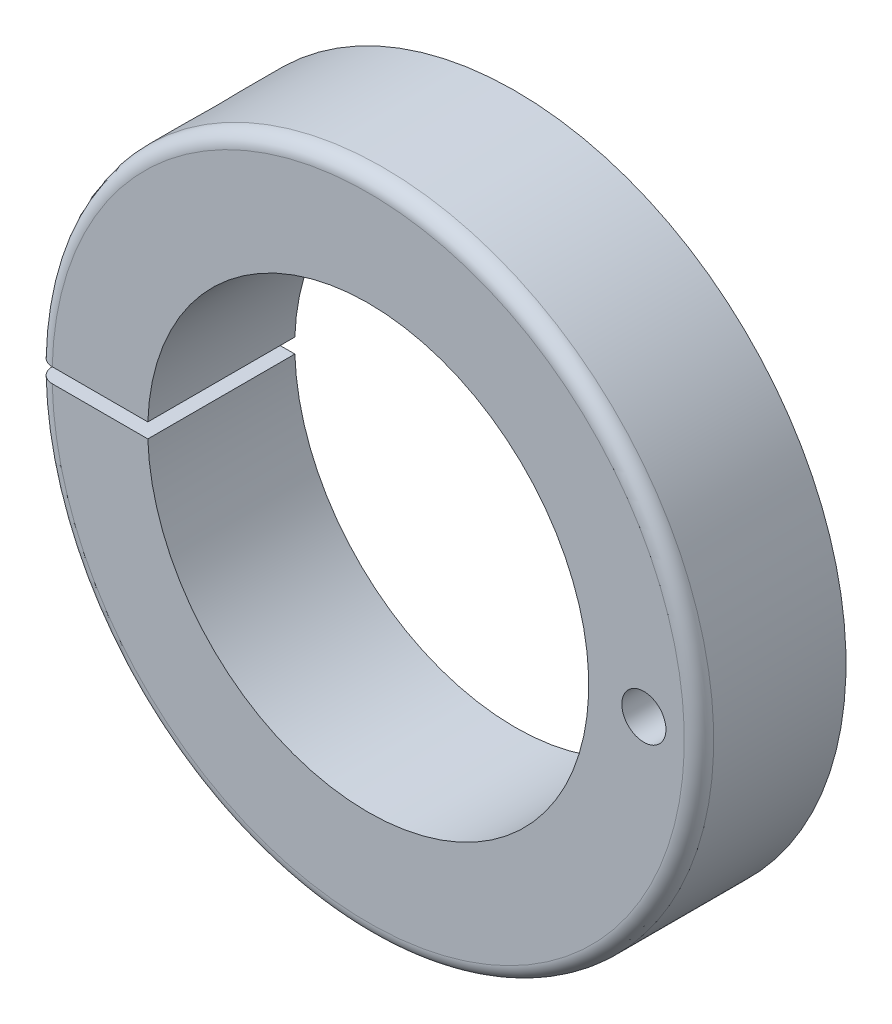
ISO-10303-21;
HEADER;
FILE_DESCRIPTION(('STEP AP214'),'2;1');
FILE_NAME('part.step','',(''),(''),'','','');
FILE_SCHEMA(('AUTOMOTIVE_DESIGN { 1 0 10303 214 1 1 1 1 }'));
ENDSEC;
DATA;
#1=APPLICATION_CONTEXT('core data for automotive mechanical design processes');
#2=APPLICATION_PROTOCOL_DEFINITION('international standard','automotive_design',2000,#1);
#3=PRODUCT_CONTEXT('',#1,'mechanical');
#4=PRODUCT('Part','Part','',(#3));
#5=PRODUCT_RELATED_PRODUCT_CATEGORY('part','',(#4));
#6=PRODUCT_DEFINITION_FORMATION('','',#4);
#7=PRODUCT_DEFINITION_CONTEXT('part definition',#1,'design');
#8=PRODUCT_DEFINITION('design','',#6,#7);
#9=PRODUCT_DEFINITION_SHAPE('','',#8);
#10=(LENGTH_UNIT() NAMED_UNIT(*) SI_UNIT(.MILLI.,.METRE.));
#11=(NAMED_UNIT(*) PLANE_ANGLE_UNIT() SI_UNIT($,.RADIAN.));
#12=(NAMED_UNIT(*) SI_UNIT($,.STERADIAN.) SOLID_ANGLE_UNIT());
#13=UNCERTAINTY_MEASURE_WITH_UNIT(LENGTH_MEASURE(1.E-05),#10,'distance_accuracy_value','');
#14=(GEOMETRIC_REPRESENTATION_CONTEXT(3) GLOBAL_UNCERTAINTY_ASSIGNED_CONTEXT((#13)) GLOBAL_UNIT_ASSIGNED_CONTEXT((#10,
#11,#12)) REPRESENTATION_CONTEXT('',''));
#15=CARTESIAN_POINT('',(0.,0.,0.));
#16=DIRECTION('',(0.,0.,1.));
#17=DIRECTION('',(1.,0.,0.));
#18=AXIS2_PLACEMENT_3D('',#15,#16,#17);
#19=CARTESIAN_POINT('',(-37.5,-45.,10.));
#20=DIRECTION('',(0.,1.,0.));
#21=DIRECTION('',(0.,0.,1.));
#22=AXIS2_PLACEMENT_3D('',#19,#20,#21);
#23=CYLINDRICAL_SURFACE('',#22,3.);
#24=CARTESIAN_POINT('',(-37.5,1.,10.));
#25=DIRECTION('',(0.,1.,0.));
#26=DIRECTION('',(0.,0.,1.));
#27=AXIS2_PLACEMENT_3D('',#24,#25,#26);
#28=CIRCLE('',#27,3.);
#29=CARTESIAN_POINT('',(-37.5,0.999999999999994,13.));
#30=VERTEX_POINT('',#29);
#31=EDGE_CURVE('E118',#30,#30,#28,.T.);
#32=CARTESIAN_POINT('',(-37.5,5.,10.));
#33=DIRECTION('',(0.,1.,0.));
#34=DIRECTION('',(0.,0.,1.));
#35=AXIS2_PLACEMENT_3D('',#32,#33,#34);
#36=CIRCLE('',#35,3.);
#37=CARTESIAN_POINT('',(-37.5,5.,13.));
#38=VERTEX_POINT('',#37);
#39=EDGE_CURVE('E123',#38,#38,#36,.F.);
#40=CARTESIAN_POINT('',(-37.5,0.999999999999994,13.));
#41=CARTESIAN_POINT('',(-37.5,1.04166666666666,13.));
#42=CARTESIAN_POINT('',(-37.5,1.08333333333333,13.));
#43=CARTESIAN_POINT('',(-37.5,1.16666666666666,13.));
#44=CARTESIAN_POINT('',(-37.5,1.20833333333333,13.));
#45=CARTESIAN_POINT('',(-37.5,1.29166666666666,13.));
#46=CARTESIAN_POINT('',(-37.5,1.33333333333333,13.));
#47=CARTESIAN_POINT('',(-37.5,1.41666666666666,13.));
#48=CARTESIAN_POINT('',(-37.5,1.45833333333333,13.));
#49=CARTESIAN_POINT('',(-37.5,1.54166666666666,13.));
#50=CARTESIAN_POINT('',(-37.5,1.58333333333333,13.));
#51=CARTESIAN_POINT('',(-37.5,1.66666666666666,13.));
#52=CARTESIAN_POINT('',(-37.5,1.70833333333333,13.));
#53=CARTESIAN_POINT('',(-37.5,1.79166666666666,13.));
#54=CARTESIAN_POINT('',(-37.5,1.83333333333333,13.));
#55=CARTESIAN_POINT('',(-37.5,1.91666666666666,13.));
#56=CARTESIAN_POINT('',(-37.5,1.95833333333333,13.));
#57=CARTESIAN_POINT('',(-37.5,2.04166666666666,13.));
#58=CARTESIAN_POINT('',(-37.5,2.08333333333333,13.));
#59=CARTESIAN_POINT('',(-37.5,2.16666666666666,13.));
#60=CARTESIAN_POINT('',(-37.5,2.20833333333333,13.));
#61=CARTESIAN_POINT('',(-37.5,2.29166666666666,13.));
#62=CARTESIAN_POINT('',(-37.5,2.33333333333333,13.));
#63=CARTESIAN_POINT('',(-37.5,2.41666666666666,13.));
#64=CARTESIAN_POINT('',(-37.5,2.45833333333333,13.));
#65=CARTESIAN_POINT('',(-37.5,2.54166666666666,13.));
#66=CARTESIAN_POINT('',(-37.5,2.58333333333333,13.));
#67=CARTESIAN_POINT('',(-37.5,2.66666666666666,13.));
#68=CARTESIAN_POINT('',(-37.5,2.70833333333333,13.));
#69=CARTESIAN_POINT('',(-37.5,2.79166666666666,13.));
#70=CARTESIAN_POINT('',(-37.5,2.83333333333333,13.));
#71=CARTESIAN_POINT('',(-37.5,2.91666666666666,13.));
#72=CARTESIAN_POINT('',(-37.5,2.95833333333333,13.));
#73=CARTESIAN_POINT('',(-37.5,3.04166666666666,13.));
#74=CARTESIAN_POINT('',(-37.5,3.08333333333333,13.));
#75=CARTESIAN_POINT('',(-37.5,3.16666666666666,13.));
#76=CARTESIAN_POINT('',(-37.5,3.20833333333333,13.));
#77=CARTESIAN_POINT('',(-37.5,3.29166666666666,13.));
#78=CARTESIAN_POINT('',(-37.5,3.33333333333333,13.));
#79=CARTESIAN_POINT('',(-37.5,3.41666666666666,13.));
#80=CARTESIAN_POINT('',(-37.5,3.45833333333333,13.));
#81=CARTESIAN_POINT('',(-37.5,3.54166666666666,13.));
#82=CARTESIAN_POINT('',(-37.5,3.58333333333333,13.));
#83=CARTESIAN_POINT('',(-37.5,3.66666666666666,13.));
#84=CARTESIAN_POINT('',(-37.5,3.70833333333333,13.));
#85=CARTESIAN_POINT('',(-37.5,3.79166666666666,13.));
#86=CARTESIAN_POINT('',(-37.5,3.83333333333333,13.));
#87=CARTESIAN_POINT('',(-37.5,3.91666666666666,13.));
#88=CARTESIAN_POINT('',(-37.5,3.95833333333333,13.));
#89=CARTESIAN_POINT('',(-37.5,4.04166666666666,13.));
#90=CARTESIAN_POINT('',(-37.5,4.08333333333333,13.));
#91=CARTESIAN_POINT('',(-37.5,4.16666666666666,13.));
#92=CARTESIAN_POINT('',(-37.5,4.20833333333333,13.));
#93=CARTESIAN_POINT('',(-37.5,4.29166666666666,13.));
#94=CARTESIAN_POINT('',(-37.5,4.33333333333333,13.));
#95=CARTESIAN_POINT('',(-37.5,4.41666666666666,13.));
#96=CARTESIAN_POINT('',(-37.5,4.45833333333333,13.));
#97=CARTESIAN_POINT('',(-37.5,4.54166666666666,13.));
#98=CARTESIAN_POINT('',(-37.5,4.58333333333333,13.));
#99=CARTESIAN_POINT('',(-37.5,4.66666666666666,13.));
#100=CARTESIAN_POINT('',(-37.5,4.70833333333333,13.));
#101=CARTESIAN_POINT('',(-37.5,4.79166666666666,13.));
#102=CARTESIAN_POINT('',(-37.5,4.83333333333333,13.));
#103=CARTESIAN_POINT('',(-37.5,4.91666666666666,13.));
#104=CARTESIAN_POINT('',(-37.5,4.95833333333333,13.));
#105=CARTESIAN_POINT('',(-37.5,5.,13.));
#106=B_SPLINE_CURVE_WITH_KNOTS('',3,(#40,#41,#42,#43,#44,#45,#46,#47,#48,#49,#50,#51,#52,#53,
#54,#55,#56,#57,#58,#59,#60,#61,#62,#63,#64,#65,#66,#67,#68,#69,#70,#71,#72,#73,#74,#75,#76,#77,
#78,#79,#80,#81,#82,#83,#84,#85,#86,#87,#88,#89,#90,#91,#92,#93,#94,#95,#96,#97,#98,#99,#100,
#101,#102,#103,#104,#105),.UNSPECIFIED.,.F.,.F.,(4,2,2,2,2,2,2,2,2,2,2,2,2,2,2,2,2,2,2,2,2,2,2,
2,2,2,2,2,2,2,2,2,4),(0.,0.125,0.25,0.375,0.5,0.625000000000001,0.750000000000001,
0.875000000000001,1.,1.125,1.25,1.375,1.5,1.625,1.75,1.875,2.,2.125,2.25,2.375,2.5,2.625,2.75,
2.875,3.,3.125,3.25,3.375,3.5,3.625,3.75,3.875,4.),.UNSPECIFIED.);
#107=EDGE_CURVE('BSEAM32',#30,#38,#106,.T.);
#108=ORIENTED_EDGE('',*,*,#31,.F.);
#109=ORIENTED_EDGE('',*,*,#39,.F.);
#110=ORIENTED_EDGE('',*,*,#107,.T.);
#111=ORIENTED_EDGE('',*,*,#107,.F.);
#112=EDGE_LOOP('',(#108,#110,#109,#111));
#113=FACE_BOUND('',#112,.T.);
#114=ADVANCED_FACE('F32',(#113),#23,.F.);
#115=CARTESIAN_POINT('',(0.,0.,20.));
#116=DIRECTION('',(0.,0.,-1.));
#117=DIRECTION('',(-1.,0.,0.));
#118=AXIS2_PLACEMENT_3D('',#115,#116,#117);
#119=CYLINDRICAL_SURFACE('',#118,45.);
#120=CARTESIAN_POINT('',(-37.5,24.8746859276655,17.));
#121=CARTESIAN_POINT('',(-37.8264549330707,24.382530066584,17.0000078774404));
#122=CARTESIAN_POINT('',(-38.1432428192413,23.8838821086372,16.977229290437));
#123=CARTESIAN_POINT('',(-38.7556311626632,22.8768191342086,16.893397142346));
#124=CARTESIAN_POINT('',(-39.0512212095184,22.3683994720993,16.8323249165217));
#125=CARTESIAN_POINT('',(-39.6210724464054,21.3428143480522,16.6774589416751));
#126=CARTESIAN_POINT('',(-39.8952710784044,20.8256282507804,16.5835733191458));
#127=CARTESIAN_POINT('',(-40.421051154808,19.7858034271867,16.3677477686881));
#128=CARTESIAN_POINT('',(-40.6726360538843,19.2631655473884,16.2458121360897));
#129=CARTESIAN_POINT('',(-41.0670923016283,18.4019310766534,16.0255293887333));
#130=CARTESIAN_POINT('',(-41.216615350141,18.0644939516555,15.9343864077902));
#131=CARTESIAN_POINT('',(-41.5064079726493,17.3883114710187,15.7427241404713));
#132=CARTESIAN_POINT('',(-41.6466777036975,17.0495661376868,15.6422050133028));
#133=CARTESIAN_POINT('',(-41.9180759155485,16.3709657639855,15.4323150868442));
#134=CARTESIAN_POINT('',(-42.0492000635373,16.0311102764186,15.322940144335));
#135=CARTESIAN_POINT('',(-42.3022943783851,15.3508174115848,15.0957714700742));
#136=CARTESIAN_POINT('',(-42.4242647697567,15.0103800487992,14.9779779449422));
#137=CARTESIAN_POINT('',(-42.6589133192903,14.3299131785005,14.7343605837979));
#138=CARTESIAN_POINT('',(-42.7716072006411,13.9898839853936,14.6085510048212));
#139=CARTESIAN_POINT('',(-42.9879918568179,13.3101374341569,14.3486264601135));
#140=CARTESIAN_POINT('',(-43.0916827486688,12.9704200720306,14.2145116023772));
#141=CARTESIAN_POINT('',(-43.2900398250759,12.2921610557189,13.937567350842));
#142=CARTESIAN_POINT('',(-43.3847114479018,11.9536188131779,13.7947432946618));
#143=CARTESIAN_POINT('',(-43.5650963531372,11.2784909359314,13.4992332268873));
#144=CARTESIAN_POINT('',(-43.6508111424668,10.9419049811231,13.3465488812292));
#145=CARTESIAN_POINT('',(-43.7659478789762,10.4672137481295,13.1214454218295));
#146=CARTESIAN_POINT('',(-43.7990943549314,10.3276213476836,13.0540393193674));
#147=CARTESIAN_POINT('',(-43.8637991160311,10.0492554568371,12.9168173166762));
#148=CARTESIAN_POINT('',(-43.8953574392673,9.91048194686612,12.8470014743123));
#149=CARTESIAN_POINT('',(-43.9568198636349,9.63420897388309,12.7047134489046));
#150=CARTESIAN_POINT('',(-43.9867264141893,9.49670789061511,12.6322454793801));
#151=CARTESIAN_POINT('',(-44.0449044561117,9.22312026885177,12.4840614772313));
#152=CARTESIAN_POINT('',(-44.0731760242821,9.08703366415876,12.4083455974673));
#153=CARTESIAN_POINT('',(-44.1355252987141,8.77987489144372,12.2317754701066));
#154=CARTESIAN_POINT('',(-44.1690810624916,8.60939392633545,12.1297014204966));
#155=CARTESIAN_POINT('',(-44.2333930367534,8.27262529148881,11.9167400437648));
#156=CARTESIAN_POINT('',(-44.264140428071,8.10635194212686,11.8058268719281));
#157=CARTESIAN_POINT('',(-44.3081612861979,7.86091839700612,11.6287230428508));
#158=CARTESIAN_POINT('',(-44.322657165251,7.77873934504053,11.5670326137652));
#159=CARTESIAN_POINT('',(-44.3506709107981,7.61739289478523,11.4396431817201));
#160=CARTESIAN_POINT('',(-44.3641891359398,7.53822439719417,11.3739456652122));
#161=CARTESIAN_POINT('',(-44.390041840593,7.38445913765951,11.2377837048461));
#162=CARTESIAN_POINT('',(-44.4023811025901,7.3098443913615,11.1673406858657));
#163=CARTESIAN_POINT('',(-44.4256667948877,7.1669614309555,11.02014447306));
#164=CARTESIAN_POINT('',(-44.4366154488551,7.09868313280576,10.9434016849591));
#165=CARTESIAN_POINT('',(-44.4539528419347,6.98915420521019,10.8037699576021));
#166=CARTESIAN_POINT('',(-44.460772914705,6.94559585013425,10.7427692080061));
#167=CARTESIAN_POINT('',(-44.473150256374,6.86589608249313,10.6158275186691));
#168=CARTESIAN_POINT('',(-44.4787069411,6.82975810174857,10.5498843122683));
#169=CARTESIAN_POINT('',(-44.4882173394408,6.76753517876709,10.411898844856));
#170=CARTESIAN_POINT('',(-44.4921450077402,6.74161388649499,10.339778201836));
#171=CARTESIAN_POINT('',(-44.497758903392,6.70446367189588,10.1918126966742));
#172=CARTESIAN_POINT('',(-44.4994522676267,6.69318796998671,10.1159804990302));
#173=CARTESIAN_POINT('',(-44.500265293871,6.68777897447309,9.9734616333962));
#174=CARTESIAN_POINT('',(-44.4996874691839,6.69163070840296,9.90685073546778));
#175=CARTESIAN_POINT('',(-44.4967076285777,6.71141594463759,9.77546340160269));
#176=CARTESIAN_POINT('',(-44.4943028241638,6.72736791531401,9.71068992701909));
#177=CARTESIAN_POINT('',(-44.4870799561122,6.77498537378613,9.56733982196671));
#178=CARTESIAN_POINT('',(-44.4817810653795,6.80975962809012,9.48984677817784));
#179=CARTESIAN_POINT('',(-44.4693319222625,6.8905870190534,9.34120216839842));
#180=CARTESIAN_POINT('',(-44.4621772446108,6.93666710092919,9.27006631435555));
#181=CARTESIAN_POINT('',(-44.4448038844355,7.04721014759231,9.11869133684755));
#182=CARTESIAN_POINT('',(-44.4342572570812,7.11349100658377,9.03984403611969));
#183=CARTESIAN_POINT('',(-44.4116723969159,7.25316427647246,8.88886844015779));
#184=CARTESIAN_POINT('',(-44.39963136353,7.32656998177314,8.81675321790657));
#185=CARTESIAN_POINT('',(-44.3742944852064,7.4784997461719,8.67746011202546));
#186=CARTESIAN_POINT('',(-44.3609914828363,7.55705210947502,8.61031477322991));
#187=CARTESIAN_POINT('',(-44.3333852190274,7.7173559458039,8.48038174031271));
#188=CARTESIAN_POINT('',(-44.3190828710602,7.79910446797013,8.4175901685108));
#189=CARTESIAN_POINT('',(-44.275544543927,8.04382230579842,8.23730139564901));
#190=CARTESIAN_POINT('',(-44.2450452347459,8.21007799387387,8.12458633973218));
#191=CARTESIAN_POINT('',(-44.1810511168332,8.54777044150002,7.90805475823808));
#192=CARTESIAN_POINT('',(-44.1475541967116,8.71921079573502,7.80424460731435));
#193=CARTESIAN_POINT('',(-44.0776976401038,9.06575303507582,7.6030749246841));
#194=CARTESIAN_POINT('',(-44.0413320168117,9.24086198579402,7.50572970820241));
#195=CARTESIAN_POINT('',(-43.965905287785,9.59331391951491,7.31626123936077));
#196=CARTESIAN_POINT('',(-43.9268439178158,9.77065712012012,7.22413850051999));
#197=CARTESIAN_POINT('',(-43.8460251271145,10.1271683817325,7.04403662551458));
#198=CARTESIAN_POINT('',(-43.804263753826,10.3063387791871,6.95606390580603));
#199=CARTESIAN_POINT('',(-43.7181277862704,10.6658089197449,6.78376755641105));
#200=CARTESIAN_POINT('',(-43.6737530331759,10.8461087308916,6.69944414905186));
#201=CARTESIAN_POINT('',(-43.5368560465281,11.387742557174,6.45146986159048));
#202=CARTESIAN_POINT('',(-43.4404536189902,11.7502863565103,6.29257840939099));
#203=CARTESIAN_POINT('',(-43.2374644201373,12.4765278046169,5.98561930894706));
#204=CARTESIAN_POINT('',(-43.1308898383049,12.8402235797532,5.83753907199766));
#205=CARTESIAN_POINT('',(-42.9074134267353,13.568304801884,5.55108118540329));
#206=CARTESIAN_POINT('',(-42.7905106517484,13.9326903090109,5.41270442591644));
#207=CARTESIAN_POINT('',(-42.5462198007557,14.6617573305893,5.14526170645138));
#208=CARTESIAN_POINT('',(-42.418822695101,15.0264388268978,5.01620394781663));
#209=CARTESIAN_POINT('',(-42.1535574309837,15.755252481579,4.76765496427037));
#210=CARTESIAN_POINT('',(-42.0156893771874,16.1193846454057,4.64816364375846));
#211=CARTESIAN_POINT('',(-41.7297895016729,16.8456691000841,4.4194715874372));
#212=CARTESIAN_POINT('',(-41.5817859801291,17.2078240818203,4.310244068216));
#213=CARTESIAN_POINT('',(-41.2752156908499,17.930719913283,4.10236948172991));
#214=CARTESIAN_POINT('',(-41.1166485747356,18.2914607159552,4.0037227636917));
#215=CARTESIAN_POINT('',(-40.7890107226937,19.010857913379,3.81794115612537));
#216=CARTESIAN_POINT('',(-40.6199466315719,19.3695154727333,3.73079909097417));
#217=CARTESIAN_POINT('',(-40.271235668496,20.0844656457416,3.56904456711));
#218=CARTESIAN_POINT('',(-40.0915898059201,20.4407584813669,3.49443091593773));
#219=CARTESIAN_POINT('',(-39.6801226857966,21.2303582902777,3.34377852627424));
#220=CARTESIAN_POINT('',(-39.4456555618588,21.662958951842,3.27119536628491));
#221=CARTESIAN_POINT('',(-38.9611098877717,22.5227755302854,3.14963127258268));
#222=CARTESIAN_POINT('',(-38.7110306857619,22.9499912214263,3.10065132513422));
#223=CARTESIAN_POINT('',(-38.1958070996749,23.7976108758383,3.02981480886129));
#224=CARTESIAN_POINT('',(-37.9306625611585,24.2180147692229,3.0079585181417));
#225=CARTESIAN_POINT('',(-37.3863425339737,25.0501163461745,2.9956309499109));
#226=CARTESIAN_POINT('',(-37.1071707131626,25.4618162660666,3.00515150959651));
#227=CARTESIAN_POINT('',(-36.6049575055858,26.1766989079192,3.05404031158289));
#228=CARTESIAN_POINT('',(-36.3845087209856,26.4822305914513,3.08570397509211));
#229=CARTESIAN_POINT('',(-35.9376238247585,27.0855689155414,3.17278861489377));
#230=CARTESIAN_POINT('',(-35.7111872114727,27.3833749046756,3.22821158769035));
#231=CARTESIAN_POINT('',(-35.2544094361898,27.9689881232851,3.3656857082773));
#232=CARTESIAN_POINT('',(-35.0240751471122,28.2568106781374,3.44769384307023));
#233=CARTESIAN_POINT('',(-34.561586025796,28.820643358743,3.64165415569811));
#234=CARTESIAN_POINT('',(-34.3294321410998,29.0966592044549,3.75359163872388));
#235=CARTESIAN_POINT('',(-33.9477187520862,29.5398987325703,3.96585797528555));
#236=CARTESIAN_POINT('',(-33.7977001036054,29.7113771264957,4.05652912444767));
#237=CARTESIAN_POINT('',(-33.499549756199,30.0471382611304,4.25297728992527));
#238=CARTESIAN_POINT('',(-33.3514175664835,30.2114229016903,4.35875028605895));
#239=CARTESIAN_POINT('',(-33.0585804681118,30.5315780213211,4.58630211980336));
#240=CARTESIAN_POINT('',(-32.9138732073235,30.6874543749385,4.70806957290958));
#241=CARTESIAN_POINT('',(-32.6296668327885,30.9894810139468,4.96839590624681));
#242=CARTESIAN_POINT('',(-32.49016651288,31.1356335580246,5.10695086576239));
#243=CARTESIAN_POINT('',(-32.1412524639762,31.4965592503484,5.48532513218955));
#244=CARTESIAN_POINT('',(-31.937002100474,31.7033017567484,5.73804497157013));
#245=CARTESIAN_POINT('',(-31.651874446604,31.9871392145714,6.14937397128043));
#246=CARTESIAN_POINT('',(-31.5603811153534,32.0773647816385,6.29184301051232));
#247=CARTESIAN_POINT('',(-31.3858030976073,32.2481969574947,6.58737578320395));
#248=CARTESIAN_POINT('',(-31.3027169598695,32.328805226845,6.74043768042614));
#249=CARTESIAN_POINT('',(-31.1599236643872,32.4664018770506,7.0293509829958));
#250=CARTESIAN_POINT('',(-31.0986532184429,32.5250682615728,7.16363525434558));
#251=CARTESIAN_POINT('',(-30.9837818867602,32.6345146976117,7.43853951751251));
#252=CARTESIAN_POINT('',(-30.9301794907803,32.685296302224,7.57915825454743));
#253=CARTESIAN_POINT('',(-30.831476585923,32.7784176071199,7.8660365712263));
#254=CARTESIAN_POINT('',(-30.7863742264992,32.8207591450099,8.01229491469739));
#255=CARTESIAN_POINT('',(-30.7054170105308,32.8965111152824,8.30962188668142));
#256=CARTESIAN_POINT('',(-30.6695622937554,32.9299214126781,8.46069058785949));
#257=CARTESIAN_POINT('',(-30.6076002530998,32.9875220321232,8.76735472222829));
#258=CARTESIAN_POINT('',(-30.581541984136,33.0116659658702,8.92296883920729));
#259=CARTESIAN_POINT('',(-30.5399296979393,33.0501664293996,9.23679972737331));
#260=CARTESIAN_POINT('',(-30.5243757535684,33.0645228912924,9.39501651660566));
#261=CARTESIAN_POINT('',(-30.5040878537379,33.0832407121064,9.71269943183037));
#262=CARTESIAN_POINT('',(-30.4993516414447,33.0876041558069,9.8721652902704));
#263=CARTESIAN_POINT('',(-30.5007908518802,33.0862775181672,10.1909995204188));
#264=CARTESIAN_POINT('',(-30.5069655676694,33.0805880881716,10.3503678977738));
#265=CARTESIAN_POINT('',(-30.5291249466296,33.0601380791584,10.6543252247717));
#266=CARTESIAN_POINT('',(-30.5442435392535,33.0461782034444,10.7990328360593));
#267=CARTESIAN_POINT('',(-30.583278806767,33.0100555057482,11.086269193147));
#268=CARTESIAN_POINT('',(-30.6071984657778,32.9878899014865,11.2287971828245));
#269=CARTESIAN_POINT('',(-30.663434264198,32.93562309012,11.5106323874177));
#270=CARTESIAN_POINT('',(-30.6957467716728,32.9055253155129,11.6499409671792));
#271=CARTESIAN_POINT('',(-30.76828540203,32.8377081686527,11.9246324355905));
#272=CARTESIAN_POINT('',(-30.8085144797643,32.7999859504407,12.0600138367096));
#273=CARTESIAN_POINT('',(-30.8975206109785,32.716158897865,12.3298052645201));
#274=CARTESIAN_POINT('',(-30.9465040071077,32.6698503796199,12.4640839285522));
#275=CARTESIAN_POINT('',(-31.0515200111614,32.5700531905258,12.7271221543236));
#276=CARTESIAN_POINT('',(-31.107555358859,32.5165617284672,12.8558795447688));
#277=CARTESIAN_POINT('',(-31.2851790571208,32.3460109212096,13.2331283640257));
#278=CARTESIAN_POINT('',(-31.4163260420418,32.2188369099117,13.4727178459475));
#279=CARTESIAN_POINT('',(-31.6579513035944,31.9811527598656,13.8609564176446));
#280=CARTESIAN_POINT('',(-31.7637095095986,31.8761800165321,14.0160980157946));
#281=CARTESIAN_POINT('',(-31.9832916607394,31.6558579002014,14.3127684933502));
#282=CARTESIAN_POINT('',(-32.0971183115582,31.540505042796,14.4542927684415));
#283=CARTESIAN_POINT('',(-32.4483303040902,31.1804043726543,14.858833118207));
#284=CARTESIAN_POINT('',(-32.6952529167047,30.9218040382981,15.1015145545422));
#285=CARTESIAN_POINT('',(-33.1276803030708,30.4569615705037,15.4716075423587));
#286=CARTESIAN_POINT('',(-33.309957458689,30.2576088178619,15.6119511137983));
#287=CARTESIAN_POINT('',(-33.6782207689984,29.8471661804979,15.8689335145793));
#288=CARTESIAN_POINT('',(-33.864208487384,29.6360712774387,15.985562107977));
#289=CARTESIAN_POINT('',(-34.2375200735089,29.2040049232253,16.1969602609755));
#290=CARTESIAN_POINT('',(-34.424845177116,28.9830229530143,16.2917058452801));
#291=CARTESIAN_POINT('',(-34.7987688719458,28.5329857574824,16.4610728851805));
#292=CARTESIAN_POINT('',(-34.9853675292333,28.3039312862856,16.5356962149701));
#293=CARTESIAN_POINT('',(-35.3732459502048,27.8179560119555,16.6725531074283));
#294=CARTESIAN_POINT('',(-35.5743248733079,27.5603901674547,16.7330525976832));
#295=CARTESIAN_POINT('',(-35.9725843559288,27.0385089033939,16.8344145251611));
#296=CARTESIAN_POINT('',(-36.1697646781947,26.7741930752888,16.8752757707917));
#297=CARTESIAN_POINT('',(-36.5590890770083,26.2400864305753,16.9392779590364));
#298=CARTESIAN_POINT('',(-36.7512365341816,25.9702995169288,16.9624311073275));
#299=CARTESIAN_POINT('',(-37.1299415388699,25.4259214197522,16.9927914810704));
#300=CARTESIAN_POINT('',(-37.3164979804759,25.1513293025398,16.9999955720497));
#301=CARTESIAN_POINT('',(-37.5,24.8746859276655,17.));
#302=B_SPLINE_CURVE_WITH_KNOTS('',3,(#120,#121,#122,#123,#124,#125,#126,#127,#128,#129,#130,
#131,#132,#133,#134,#135,#136,#137,#138,#139,#140,#141,#142,#143,#144,#145,#146,#147,#148,#149,
#150,#151,#152,#153,#154,#155,#156,#157,#158,#159,#160,#161,#162,#163,#164,#165,#166,#167,#168,
#169,#170,#171,#172,#173,#174,#175,#176,#177,#178,#179,#180,#181,#182,#183,#184,#185,#186,#187,
#188,#189,#190,#191,#192,#193,#194,#195,#196,#197,#198,#199,#200,#201,#202,#203,#204,#205,#206,
#207,#208,#209,#210,#211,#212,#213,#214,#215,#216,#217,#218,#219,#220,#221,#222,#223,#224,#225,
#226,#227,#228,#229,#230,#231,#232,#233,#234,#235,#236,#237,#238,#239,#240,#241,#242,#243,#244,
#245,#246,#247,#248,#249,#250,#251,#252,#253,#254,#255,#256,#257,#258,#259,#260,#261,#262,#263,
#264,#265,#266,#267,#268,#269,#270,#271,#272,#273,#274,#275,#276,#277,#278,#279,#280,#281,#282,
#283,#284,#285,#286,#287,#288,#289,#290,#291,#292,#293,#294,#295,#296,#297,#298,#299,#300,#301),
.UNSPECIFIED.,.T.,.F.,(4,2,2,2,2,2,2,2,2,2,2,2,2,2,2,2,2,2,2,2,2,2,2,2,2,2,2,2,2,2,2,2,2,2,2,2,
2,2,2,2,2,2,2,2,2,2,2,2,2,2,2,2,2,2,2,2,2,2,2,2,2,2,2,2,2,2,2,2,2,2,2,2,2,2,2,2,2,2,2,2,2,2,2,2,
2,2,2,2,2,2,4),(0.,1.77148044529739,3.54382500136731,5.3211721937416,7.09824739988549,
8.23854255755539,9.37881835649798,10.5196307540871,11.6604151620079,12.7992243833278,
13.9380187996801,15.0761221627089,16.214033739042,16.6895695955758,17.1650940409785,
17.639893272781,18.1146701830007,18.7190595370696,19.3252859159922,19.6365203167691,
19.947639957403,20.2574385796252,20.5667354052888,20.7921401923664,21.0176489924026,
21.2466359327725,21.4748896509766,21.6738390399197,21.8730926942219,22.1269668062015,
22.3814519569889,22.6913646096183,23.0018670779961,23.3142499213265,23.6263508689126,
24.2353487028794,24.844778917062,25.4555164486221,26.0663139293885,26.67802674624,
27.289776778189,28.5116529330819,29.7320828469316,30.9526245720587,32.1742276842479,
33.3958185870526,34.6141276658126,35.8324769433444,37.0500626916633,38.2675324839254,
39.7588915895521,41.2503130064817,42.7417497151597,44.2327984517167,45.3663095652863,
46.4999159469177,47.6316973079585,48.7629240004644,49.4980793064834,50.233039274372,
50.9674789202394,51.7017473674645,52.8519835151812,53.4269891946498,54.0018954472144,
54.4779315252016,54.9538737172401,55.4297121717081,55.9055578175928,56.383755451025,
56.8619564013852,57.3400575786558,57.81812777999,58.2561076898328,58.6942362397719,
59.1321755082293,59.5702785481844,60.0205469419351,60.4709908139003,61.3714813228655,
62.0160286501089,62.6607931526228,63.9515261042967,64.8636873955742,65.7762415653294,
66.6897908475997,67.6032550121574,68.5994446317529,69.5956946896526,70.5912574409404,
71.5870158330766),.UNSPECIFIED.);
#303=CARTESIAN_POINT('',(-37.5,24.8746859276655,17.));
#304=VERTEX_POINT('',#303);
#305=EDGE_CURVE('E122',#304,#304,#302,.T.);
#306=ORIENTED_EDGE('',*,*,#305,.T.);
#307=EDGE_LOOP('',(#306));
#308=FACE_BOUND('',#307,.T.);
#309=CARTESIAN_POINT('',(-37.5,-24.8746859276655,13.));
#310=CARTESIAN_POINT('',(-37.3637731000271,-25.0800558278484,12.9999995778597));
#311=CARTESIAN_POINT('',(-37.2258500274668,-25.2843131787148,12.9907483176773));
#312=CARTESIAN_POINT('',(-36.9474715276632,-25.6893895458864,12.9520290430569));
#313=CARTESIAN_POINT('',(-36.8070148489885,-25.8902067619096,12.9225507559265));
#314=CARTESIAN_POINT('',(-36.5258886192535,-26.2853169167541,12.8411971397003));
#315=CARTESIAN_POINT('',(-36.3852255123999,-26.4796420096866,12.7894585731847));
#316=CARTESIAN_POINT('',(-36.1051013429221,-26.8603290532269,12.6604534190448));
#317=CARTESIAN_POINT('',(-35.9656387631777,-27.0467028020822,12.5832262528701));
#318=CARTESIAN_POINT('',(-35.7207735248298,-27.3689257080702,12.4189144106639));
#319=CARTESIAN_POINT('',(-35.6145049693856,-27.507010715336,12.3375360682157));
#320=CARTESIAN_POINT('',(-35.4070910830687,-27.7734821722692,12.1538225333384));
#321=CARTESIAN_POINT('',(-35.3059522583769,-27.9018564020759,12.0514615181359));
#322=CARTESIAN_POINT('',(-35.160659359058,-28.0844129880299,11.8796779050475));
#323=CARTESIAN_POINT('',(-35.1129957191323,-28.1439679808951,11.8188989513072));
#324=CARTESIAN_POINT('',(-35.0208001104295,-28.2586089331213,11.6910949206482));
#325=CARTESIAN_POINT('',(-34.976268718608,-28.3136940694269,11.6240686982509));
#326=CARTESIAN_POINT('',(-34.848893597026,-28.4705557604061,11.4136260050055));
#327=CARTESIAN_POINT('',(-34.7717875407124,-28.564540765921,11.2603000713569));
#328=CARTESIAN_POINT('',(-34.6672411537121,-28.6912250059815,10.9936514074043));
#329=CARTESIAN_POINT('',(-34.6321323670826,-28.7335611208876,10.8878429091851));
#330=CARTESIAN_POINT('',(-34.5732674508835,-28.8043623388849,10.6686302849509));
#331=CARTESIAN_POINT('',(-34.5495020812288,-28.8328387321587,10.5552324272112));
#332=CARTESIAN_POINT('',(-34.5151024207257,-28.8740101282788,10.3228795511881));
#333=CARTESIAN_POINT('',(-34.5045486823224,-28.8866083235293,10.2038949880566));
#334=CARTESIAN_POINT('',(-34.4978272624849,-28.8946352938262,9.96494132031282));
#335=CARTESIAN_POINT('',(-34.5016562967683,-28.8900679885864,9.84497244670879));
#336=CARTESIAN_POINT('',(-34.5223785848846,-28.8653007323043,9.61842667525472));
#337=CARTESIAN_POINT('',(-34.5381195387283,-28.8464795160361,9.51158559890811));
#338=CARTESIAN_POINT('',(-34.5801190156619,-28.7961184401771,9.30313708762326));
#339=CARTESIAN_POINT('',(-34.6063814266352,-28.7645738790331,9.20153160301948));
#340=CARTESIAN_POINT('',(-34.6776399813992,-28.6786554419289,8.97400734759492));
#341=CARTESIAN_POINT('',(-34.7259393347525,-28.6202095152554,8.85066472256838));
#342=CARTESIAN_POINT('',(-34.8342090724773,-28.4883340984624,8.6179295558709));
#343=CARTESIAN_POINT('',(-34.8942009242933,-28.4148770356588,8.50856329582139));
#344=CARTESIAN_POINT('',(-35.0500326740854,-28.2226193659945,8.26004066491081));
#345=CARTESIAN_POINT('',(-35.1502098394837,-28.0978861509212,8.12823460590019));
#346=CARTESIAN_POINT('',(-35.3604970310755,-27.8327871622278,7.89103084728169));
#347=CARTESIAN_POINT('',(-35.4706267948864,-27.6923901895977,7.78568726227118));
#348=CARTESIAN_POINT('',(-35.6725726184147,-27.4315304098918,7.6180042931669));
#349=CARTESIAN_POINT('',(-35.7633936761285,-27.3130507983316,7.55127900826908));
#350=CARTESIAN_POINT('',(-35.946976810661,-27.0709796209613,7.43091891561558));
#351=CARTESIAN_POINT('',(-36.0397399620359,-26.9473851861063,7.37729157451049));
#352=CARTESIAN_POINT('',(-36.2261857773227,-26.696216269099,7.28184351945772));
#353=CARTESIAN_POINT('',(-36.319869321384,-26.568637657037,7.24003554095225));
#354=CARTESIAN_POINT('',(-36.5073192637661,-26.3104754482417,7.16721106262209));
#355=CARTESIAN_POINT('',(-36.6010856789085,-26.1798909153332,7.13619797463606));
#356=CARTESIAN_POINT('',(-36.8402142138654,-25.8430223302431,7.06954656808154));
#357=CARTESIAN_POINT('',(-36.985228526195,-25.6350816624828,7.04095132910019));
#358=CARTESIAN_POINT('',(-37.2725685840788,-25.2154794794064,7.00513106419335));
#359=CARTESIAN_POINT('',(-37.4148926889954,-25.0038158364307,6.99791868586415));
#360=CARTESIAN_POINT('',(-37.6961544458342,-24.5777391886744,7.0031090140056));
#361=CARTESIAN_POINT('',(-37.8350824887061,-24.3633205298558,7.01556201576486));
#362=CARTESIAN_POINT('',(-38.1083752091336,-23.9335865439819,7.05907828420752));
#363=CARTESIAN_POINT('',(-38.2427413719439,-23.7182715348948,7.09013543115671));
#364=CARTESIAN_POINT('',(-38.5112104792788,-23.2799301619359,7.17194862338354));
#365=CARTESIAN_POINT('',(-38.6451197128276,-23.0569132640202,7.22339105264195));
#366=CARTESIAN_POINT('',(-38.9068381224446,-22.6124838836325,7.34636850388358));
#367=CARTESIAN_POINT('',(-39.034642073514,-22.3910729082529,7.4179203877923));
#368=CARTESIAN_POINT('',(-39.2209339956283,-22.0620550968724,7.54156159121843));
#369=CARTESIAN_POINT('',(-39.2821375529872,-21.9528831416629,7.58550186782748));
#370=CARTESIAN_POINT('',(-39.4025732022199,-21.7359746298243,7.6792149675559));
#371=CARTESIAN_POINT('',(-39.4618056673666,-21.6282378037637,7.72898667819092));
#372=CARTESIAN_POINT('',(-39.5779822302765,-21.4149025223906,7.83478589759275));
#373=CARTESIAN_POINT('',(-39.6349302430341,-21.3093005773326,7.89080202234307));
#374=CARTESIAN_POINT('',(-39.7463555413803,-21.1007391209676,8.00988890420359));
#375=CARTESIAN_POINT('',(-39.8008323687007,-20.9977801013015,8.07296096234342));
#376=CARTESIAN_POINT('',(-39.9015812500325,-20.8056335301493,8.20046176891299));
#377=CARTESIAN_POINT('',(-39.948131067339,-20.7160931936521,8.26413492676243));
#378=CARTESIAN_POINT('',(-40.0383069099097,-20.5412666315704,8.39888495483782));
#379=CARTESIAN_POINT('',(-40.0819350986858,-20.4559772703131,8.46995624473457));
#380=CARTESIAN_POINT('',(-40.1651701226475,-20.2920546368135,8.62008031564588));
#381=CARTESIAN_POINT('',(-40.2048082242258,-20.213370573802,8.6990594539289));
#382=CARTESIAN_POINT('',(-40.2792260268381,-20.0646660072946,8.86673258779941));
#383=CARTESIAN_POINT('',(-40.3140167043131,-19.9946259728921,8.95540379597097));
#384=CARTESIAN_POINT('',(-40.3685420447728,-19.8842538324418,9.1186592990975));
#385=CARTESIAN_POINT('',(-40.3898194339153,-19.8409763174901,9.19071167216019));
#386=CARTESIAN_POINT('',(-40.4277215229387,-19.7636329306462,9.34088197543728));
#387=CARTESIAN_POINT('',(-40.4443456405536,-19.7295682115731,9.41900066317138));
#388=CARTESIAN_POINT('',(-40.4718169915461,-19.6731553670209,9.58148938130721));
#389=CARTESIAN_POINT('',(-40.4825961038447,-19.6509454490855,9.66592060029971));
#390=CARTESIAN_POINT('',(-40.4968553829045,-19.6215441184604,9.83793423202165));
#391=CARTESIAN_POINT('',(-40.5003470849169,-19.6143289706062,9.92551144105665));
#392=CARTESIAN_POINT('',(-40.4996366716259,-19.6157950984394,10.0911421200876));
#393=CARTESIAN_POINT('',(-40.4962129927519,-19.6228680330754,10.1692183174633));
#394=CARTESIAN_POINT('',(-40.483573436626,-19.6489308815819,10.3228734270677));
#395=CARTESIAN_POINT('',(-40.474352439753,-19.6679313286359,10.3984500697753));
#396=CARTESIAN_POINT('',(-40.4475700919517,-19.7229623632759,10.5665857469896));
#397=CARTESIAN_POINT('',(-40.4283727661081,-19.7623192056135,10.6577777552931));
#398=CARTESIAN_POINT('',(-40.3837143874689,-19.8534171856512,10.832068921733));
#399=CARTESIAN_POINT('',(-40.3582395369068,-19.9051855966428,10.9151496823215));
#400=CARTESIAN_POINT('',(-40.3073548397257,-20.0079950786274,11.0600063852458));
#401=CARTESIAN_POINT('',(-40.2826564742259,-20.0576905605902,11.1230140100409));
#402=CARTESIAN_POINT('',(-40.2307085030018,-20.1616836273398,11.2440108366165));
#403=CARTESIAN_POINT('',(-40.2034571023371,-20.2159844473827,11.3019964516533));
#404=CARTESIAN_POINT('',(-40.118541112816,-20.3842675890815,11.469343232187));
#405=CARTESIAN_POINT('',(-40.0577929302459,-20.5034718105914,11.5718848162189));
#406=CARTESIAN_POINT('',(-39.9307728715706,-20.7497624937801,11.7619135380907));
#407=CARTESIAN_POINT('',(-39.8645136195312,-20.876830779269,11.8494337478323));
#408=CARTESIAN_POINT('',(-39.7275183172947,-21.1363630077906,12.0123330335193));
#409=CARTESIAN_POINT('',(-39.6567780670446,-21.2688319701851,12.0877004768997));
#410=CARTESIAN_POINT('',(-39.5115484390679,-21.5374301688041,12.2279749209209));
#411=CARTESIAN_POINT('',(-39.4370541174148,-21.6735641156734,12.2928676280521));
#412=CARTESIAN_POINT('',(-39.2848669309408,-21.9482096501349,12.4132245633891));
#413=CARTESIAN_POINT('',(-39.2071731995788,-22.0867218758682,12.4686862161077));
#414=CARTESIAN_POINT('',(-39.0043677570022,-22.4437501970103,12.5997301411361));
#415=CARTESIAN_POINT('',(-38.8771873743091,-22.663402215038,12.6690594860477));
#416=CARTESIAN_POINT('',(-38.6166954577433,-23.1044699629545,12.7880962196259));
#417=CARTESIAN_POINT('',(-38.4833807014783,-23.3258865681075,12.8377931609095));
#418=CARTESIAN_POINT('',(-38.2110638033595,-23.7693592890874,12.917974198365));
#419=CARTESIAN_POINT('',(-38.0720503743485,-23.9914157752751,12.9484179875133));
#420=CARTESIAN_POINT('',(-37.7893364520462,-24.4343004175693,12.9894278120477));
#421=CARTESIAN_POINT('',(-37.6456375320625,-24.6551289574305,13.000000451302));
#422=CARTESIAN_POINT('',(-37.5,-24.8746859276655,13.));
#423=B_SPLINE_CURVE_WITH_KNOTS('',3,(#309,#310,#311,#312,#313,#314,#315,#316,#317,#318,#319,
#320,#321,#322,#323,#324,#325,#326,#327,#328,#329,#330,#331,#332,#333,#334,#335,#336,#337,#338,
#339,#340,#341,#342,#343,#344,#345,#346,#347,#348,#349,#350,#351,#352,#353,#354,#355,#356,#357,
#358,#359,#360,#361,#362,#363,#364,#365,#366,#367,#368,#369,#370,#371,#372,#373,#374,#375,#376,
#377,#378,#379,#380,#381,#382,#383,#384,#385,#386,#387,#388,#389,#390,#391,#392,#393,#394,#395,
#396,#397,#398,#399,#400,#401,#402,#403,#404,#405,#406,#407,#408,#409,#410,#411,#412,#413,#414,
#415,#416,#417,#418,#419,#420,#421,#422),.UNSPECIFIED.,.T.,.F.,(4,2,2,2,2,2,2,2,2,2,2,2,2,2,2,2,
2,2,2,2,2,2,2,2,2,2,2,2,2,2,2,2,2,2,2,2,2,2,2,2,2,2,2,2,2,2,2,2,2,2,2,2,2,2,2,2,4),(0.,
0.739135934235052,1.47864753126225,2.21367918440304,2.94757930102028,3.52339895298934,
4.09993155062158,4.39220354904292,4.68452924331797,5.26638438097092,5.62282509392164,
5.97897496089453,6.3372858922654,6.69551500889696,7.0229244768982,7.35045504083453,
7.78240806621302,8.21516175858795,8.8335829567663,9.45325868852139,9.94315466794503,
10.4333292704105,10.9240300435581,11.4148857673179,12.1791079937752,12.9437821545143,
13.7104151808974,14.4767961658139,15.271535095972,16.0669424190209,16.4647628570798,
16.8625075246518,17.2595385809511,17.6566429660626,18.0143449350122,18.3717790220149,
18.7261490624454,19.079703157117,19.3391582328273,19.5986457597654,19.8610958335862,
20.1231301587836,20.3573087726849,20.5916944811525,20.8934889335945,21.1959527300775,
21.4474817047543,21.6991888661804,22.203417240997,22.706520826751,23.2101031580616,
23.7143669572592,24.2187682433599,25.0071618909341,25.7959745188254,26.5864331288651,
27.3766289957764),.UNSPECIFIED.);
#424=CARTESIAN_POINT('',(-37.5,-24.8746859276655,13.));
#425=VERTEX_POINT('',#424);
#426=EDGE_CURVE('E147',#425,#425,#423,.T.);
#427=ORIENTED_EDGE('',*,*,#426,.T.);
#428=EDGE_LOOP('',(#427));
#429=FACE_BOUND('',#428,.T.);
#430=DIRECTION('',(0.,0.,-1.));
#431=VECTOR('',#430,1.);
#432=CARTESIAN_POINT('',(-44.988887516808,0.999999999999999,20.));
#433=LINE('',#432,#431);
#434=CARTESIAN_POINT('',(-44.988887516808,0.999999999999999,0.));
#435=VERTEX_POINT('',#434);
#436=CARTESIAN_POINT('',(-44.988887516808,0.999999999999999,18.));
#437=VERTEX_POINT('',#436);
#438=EDGE_CURVE('E107',#435,#437,#433,.F.);
#439=ORIENTED_EDGE('',*,*,#438,.T.);
#440=CARTESIAN_POINT('',(0.,0.,18.));
#441=DIRECTION('',(0.,0.,1.));
#442=DIRECTION('',(1.,0.,0.));
#443=AXIS2_PLACEMENT_3D('',#440,#441,#442);
#444=CIRCLE('',#443,45.);
#445=CARTESIAN_POINT('',(-44.988887516808,-0.999999999999999,18.));
#446=VERTEX_POINT('',#445);
#447=EDGE_CURVE('E46',#437,#446,#444,.F.);
#448=ORIENTED_EDGE('',*,*,#447,.T.);
#449=DIRECTION('',(0.,0.,-1.));
#450=VECTOR('',#449,1.);
#451=CARTESIAN_POINT('',(-44.988887516808,-0.999999999999999,20.));
#452=LINE('',#451,#450);
#453=CARTESIAN_POINT('',(-44.988887516808,-0.999999999999999,0.));
#454=VERTEX_POINT('',#453);
#455=EDGE_CURVE('E111',#446,#454,#452,.T.);
#456=ORIENTED_EDGE('',*,*,#455,.T.);
#457=CARTESIAN_POINT('',(0.,0.,0.));
#458=DIRECTION('',(0.,0.,1.));
#459=DIRECTION('',(1.,0.,0.));
#460=AXIS2_PLACEMENT_3D('',#457,#458,#459);
#461=CIRCLE('',#460,45.);
#462=EDGE_CURVE('E109',#454,#435,#461,.T.);
#463=ORIENTED_EDGE('',*,*,#462,.T.);
#464=EDGE_LOOP('',(#439,#448,#456,#463));
#465=FACE_BOUND('',#464,.T.);
#466=ADVANCED_FACE('F34',(#308,#429,#465),#119,.T.);
#467=CARTESIAN_POINT('',(0.,0.,20.));
#468=DIRECTION('',(0.,0.,1.));
#469=DIRECTION('',(1.,0.,0.));
#470=AXIS2_PLACEMENT_3D('',#467,#468,#469);
#471=PLANE('',#470);
#472=CARTESIAN_POINT('',(37.5,0.,20.));
#473=DIRECTION('',(0.,0.,1.));
#474=DIRECTION('',(1.,0.,0.));
#475=AXIS2_PLACEMENT_3D('',#472,#473,#474);
#476=CIRCLE('',#475,3.);
#477=CARTESIAN_POINT('',(40.5,0.,20.));
#478=VERTEX_POINT('',#477);
#479=EDGE_CURVE('E195',#478,#478,#476,.T.);
#480=ORIENTED_EDGE('',*,*,#479,.F.);
#481=EDGE_LOOP('',(#480));
#482=FACE_BOUND('',#481,.T.);
#483=DIRECTION('',(1.,0.,0.));
#484=VECTOR('',#483,1.);
#485=CARTESIAN_POINT('',(-50.,-0.999999999999999,20.));
#486=LINE('',#485,#484);
#487=CARTESIAN_POINT('',(-42.9883705204094,-0.999999999999999,20.));
#488=VERTEX_POINT('',#487);
#489=CARTESIAN_POINT('',(-29.9833287011299,-0.999999999999999,20.));
#490=VERTEX_POINT('',#489);
#491=EDGE_CURVE('E102',#488,#490,#486,.T.);
#492=ORIENTED_EDGE('',*,*,#491,.F.);
#493=CARTESIAN_POINT('',(0.,0.,20.));
#494=DIRECTION('',(0.,0.,1.));
#495=DIRECTION('',(1.,0.,0.));
#496=AXIS2_PLACEMENT_3D('',#493,#494,#495);
#497=CIRCLE('',#496,43.);
#498=CARTESIAN_POINT('',(-42.9883705204094,0.999999999999999,20.));
#499=VERTEX_POINT('',#498);
#500=EDGE_CURVE('E91',#488,#499,#497,.T.);
#501=ORIENTED_EDGE('',*,*,#500,.T.);
#502=DIRECTION('',(-1.,0.,0.));
#503=VECTOR('',#502,1.);
#504=CARTESIAN_POINT('',(-50.,0.999999999999999,20.));
#505=LINE('',#504,#503);
#506=CARTESIAN_POINT('',(-29.9833287011299,0.999999999999999,20.));
#507=VERTEX_POINT('',#506);
#508=EDGE_CURVE('E84',#507,#499,#505,.T.);
#509=ORIENTED_EDGE('',*,*,#508,.F.);
#510=CARTESIAN_POINT('',(0.,0.,20.));
#511=DIRECTION('',(0.,0.,1.));
#512=DIRECTION('',(1.,0.,0.));
#513=AXIS2_PLACEMENT_3D('',#510,#511,#512);
#514=CIRCLE('',#513,30.);
#515=EDGE_CURVE('E99',#490,#507,#514,.T.);
#516=ORIENTED_EDGE('',*,*,#515,.F.);
#517=EDGE_LOOP('',(#492,#501,#509,#516));
#518=FACE_BOUND('',#517,.T.);
#519=ADVANCED_FACE('F98',(#482,#518),#471,.T.);
#520=CARTESIAN_POINT('',(0.,0.,0.));
#521=DIRECTION('',(0.,0.,1.));
#522=DIRECTION('',(1.,0.,0.));
#523=AXIS2_PLACEMENT_3D('',#520,#521,#522);
#524=PLANE('',#523);
#525=CARTESIAN_POINT('',(37.5,0.,0.));
#526=DIRECTION('',(0.,0.,1.));
#527=DIRECTION('',(1.,0.,0.));
#528=AXIS2_PLACEMENT_3D('',#525,#526,#527);
#529=CIRCLE('',#528,3.);
#530=CARTESIAN_POINT('',(40.5,0.,0.));
#531=VERTEX_POINT('',#530);
#532=EDGE_CURVE('E194',#531,#531,#529,.T.);
#533=ORIENTED_EDGE('',*,*,#532,.T.);
#534=EDGE_LOOP('',(#533));
#535=FACE_BOUND('',#534,.T.);
#536=CARTESIAN_POINT('',(0.,0.,0.));
#537=DIRECTION('',(0.,0.,1.));
#538=DIRECTION('',(1.,0.,0.));
#539=AXIS2_PLACEMENT_3D('',#536,#537,#538);
#540=CIRCLE('',#539,30.);
#541=CARTESIAN_POINT('',(-29.9833287011299,-0.999999999999999,0.));
#542=VERTEX_POINT('',#541);
#543=CARTESIAN_POINT('',(-29.9833287011299,0.999999999999999,0.));
#544=VERTEX_POINT('',#543);
#545=EDGE_CURVE('E106',#542,#544,#540,.T.);
#546=ORIENTED_EDGE('',*,*,#545,.T.);
#547=DIRECTION('',(-1.,0.,0.));
#548=VECTOR('',#547,1.);
#549=CARTESIAN_POINT('',(-50.,0.999999999999999,0.));
#550=LINE('',#549,#548);
#551=EDGE_CURVE('E86',#544,#435,#550,.T.);
#552=ORIENTED_EDGE('',*,*,#551,.T.);
#553=ORIENTED_EDGE('',*,*,#462,.F.);
#554=DIRECTION('',(1.,0.,0.));
#555=VECTOR('',#554,1.);
#556=CARTESIAN_POINT('',(-50.,-0.999999999999999,0.));
#557=LINE('',#556,#555);
#558=EDGE_CURVE('E101',#454,#542,#557,.T.);
#559=ORIENTED_EDGE('',*,*,#558,.T.);
#560=EDGE_LOOP('',(#546,#552,#553,#559));
#561=FACE_BOUND('',#560,.T.);
#562=ADVANCED_FACE('F163',(#535,#561),#524,.F.);
#563=CARTESIAN_POINT('',(0.,0.,0.));
#564=DIRECTION('',(0.,0.,1.));
#565=DIRECTION('',(1.,0.,0.));
#566=AXIS2_PLACEMENT_3D('',#563,#564,#565);
#567=CYLINDRICAL_SURFACE('',#566,30.);
#568=ORIENTED_EDGE('',*,*,#515,.T.);
#569=DIRECTION('',(0.,0.,1.));
#570=VECTOR('',#569,1.);
#571=CARTESIAN_POINT('',(-29.9833287011299,0.999999999999999,0.));
#572=LINE('',#571,#570);
#573=EDGE_CURVE('E81',#507,#544,#572,.F.);
#574=ORIENTED_EDGE('',*,*,#573,.T.);
#575=ORIENTED_EDGE('',*,*,#545,.F.);
#576=DIRECTION('',(0.,0.,1.));
#577=VECTOR('',#576,1.);
#578=CARTESIAN_POINT('',(-29.9833287011299,-0.999999999999999,0.));
#579=LINE('',#578,#577);
#580=EDGE_CURVE('E92',#542,#490,#579,.T.);
#581=ORIENTED_EDGE('',*,*,#580,.T.);
#582=EDGE_LOOP('',(#568,#574,#575,#581));
#583=FACE_BOUND('',#582,.T.);
#584=ADVANCED_FACE('F105',(#583),#567,.F.);
#585=CARTESIAN_POINT('',(-50.,-0.999999999999999,0.));
#586=DIRECTION('',(0.,-1.,0.));
#587=DIRECTION('',(0.,0.,-1.));
#588=AXIS2_PLACEMENT_3D('',#585,#586,#587);
#589=PLANE('',#588);
#590=CARTESIAN_POINT('',(-37.5,-1.,10.));
#591=DIRECTION('',(0.,-1.,0.));
#592=DIRECTION('',(0.,0.,-1.));
#593=AXIS2_PLACEMENT_3D('',#590,#591,#592);
#594=CIRCLE('',#593,3.);
#595=CARTESIAN_POINT('',(-37.5,-1.,7.));
#596=VERTEX_POINT('',#595);
#597=EDGE_CURVE('E121',#596,#596,#594,.T.);
#598=ORIENTED_EDGE('',*,*,#597,.T.);
#599=EDGE_LOOP('',(#598));
#600=FACE_BOUND('',#599,.T.);
#601=ORIENTED_EDGE('',*,*,#455,.F.);
#602=CARTESIAN_POINT('',(-44.988887516808,-0.999999999999999,18.));
#603=CARTESIAN_POINT('',(-44.9888871496323,-0.999999999999999,18.0562592670585));
#604=CARTESIAN_POINT('',(-44.9865116113635,-0.999999999999999,18.1124915781959));
#605=CARTESIAN_POINT('',(-44.9770346703026,-0.999999999999999,18.2245537359713));
#606=CARTESIAN_POINT('',(-44.9699334964356,-0.999999999999999,18.2803836019727));
#607=CARTESIAN_POINT('',(-44.9416091904969,-0.999999999999999,18.4465712852604));
#608=CARTESIAN_POINT('',(-44.9133650857382,-0.999999999999999,18.5558157867318));
#609=CARTESIAN_POINT('',(-44.8389385580335,-0.999999999999999,18.7680091297886));
#610=CARTESIAN_POINT('',(-44.7927475654413,-0.999999999999999,18.8709549365222));
#611=CARTESIAN_POINT('',(-44.6837446220951,-0.999999999999999,19.0676288788593));
#612=CARTESIAN_POINT('',(-44.6209355680032,-0.999999999999999,19.1613586169964));
#613=CARTESIAN_POINT('',(-44.4804722705259,-0.999999999999999,19.3369513650951));
#614=CARTESIAN_POINT('',(-44.4028165911813,-0.999999999999999,19.4188132258532));
#615=CARTESIAN_POINT('',(-44.2348485022059,-0.999999999999999,19.568358959216));
#616=CARTESIAN_POINT('',(-44.1445336147,-0.999999999999999,19.6360400496337));
#617=CARTESIAN_POINT('',(-43.9537950072972,-0.999999999999999,19.755308046616));
#618=CARTESIAN_POINT('',(-43.853366954576,-0.999999999999999,19.8068880157787));
#619=CARTESIAN_POINT('',(-43.6452977354918,-0.999999999999999,19.8924334559842));
#620=CARTESIAN_POINT('',(-43.537660807591,-0.999999999999999,19.9264091765511));
#621=CARTESIAN_POINT('',(-43.3558685049418,-0.999999999999999,19.9673570832255));
#622=CARTESIAN_POINT('',(-43.282854805772,-0.999999999999999,19.9795907968961));
#623=CARTESIAN_POINT('',(-43.1360277567407,-0.999999999999999,19.9959111905958));
#624=CARTESIAN_POINT('',(-43.0622156902509,-0.999999999999999,20.0000094199249));
#625=CARTESIAN_POINT('',(-42.9883705204094,-0.999999999999999,20.));
#626=B_SPLINE_CURVE_WITH_KNOTS('',3,(#602,#603,#604,#605,#606,#607,#608,#609,#610,#611,#612,
#613,#614,#615,#616,#617,#618,#619,#620,#621,#622,#623,#624,#625),.UNSPECIFIED.,.F.,.F.,(4,2,2,
2,2,2,2,2,2,2,2,4),(0.,0.168674121708924,0.337340072891355,0.674113380782479,1.01104769608509,
1.34792331966294,1.68483154220103,2.02180580246134,2.35892505321094,2.69584780562878,
2.91752014181236,3.13887756172662),.UNSPECIFIED.);
#627=EDGE_CURVE('E11',#446,#488,#626,.T.);
#628=ORIENTED_EDGE('',*,*,#627,.T.);
#629=ORIENTED_EDGE('',*,*,#491,.T.);
#630=ORIENTED_EDGE('',*,*,#580,.F.);
#631=ORIENTED_EDGE('',*,*,#558,.F.);
#632=EDGE_LOOP('',(#601,#628,#629,#630,#631));
#633=FACE_BOUND('',#632,.T.);
#634=ADVANCED_FACE('F161',(#600,#633),#589,.F.);
#635=CARTESIAN_POINT('',(-50.,0.999999999999999,0.));
#636=DIRECTION('',(0.,1.,0.));
#637=DIRECTION('',(0.,0.,1.));
#638=AXIS2_PLACEMENT_3D('',#635,#636,#637);
#639=PLANE('',#638);
#640=ORIENTED_EDGE('',*,*,#31,.T.);
#641=EDGE_LOOP('',(#640));
#642=FACE_BOUND('',#641,.T.);
#643=ORIENTED_EDGE('',*,*,#508,.T.);
#644=CARTESIAN_POINT('',(-42.9883705204094,0.999999999999999,20.));
#645=CARTESIAN_POINT('',(-43.0446654299605,0.999999999999999,19.999999617583));
#646=CARTESIAN_POINT('',(-43.1009333760137,0.999999999999999,19.9976229580102));
#647=CARTESIAN_POINT('',(-43.2130667223319,0.999999999999999,19.9881414108262));
#648=CARTESIAN_POINT('',(-43.2689321415223,0.999999999999999,19.9810367469952));
#649=CARTESIAN_POINT('',(-43.4352275905796,0.999999999999999,19.9526979370327));
#650=CARTESIAN_POINT('',(-43.5445438566212,0.999999999999999,19.9244387868916));
#651=CARTESIAN_POINT('',(-43.7568775970549,0.999999999999999,19.849969308791));
#652=CARTESIAN_POINT('',(-43.8598920001914,0.999999999999999,19.803750307386));
#653=CARTESIAN_POINT('',(-44.0566946268238,0.999999999999999,19.6946763930376));
#654=CARTESIAN_POINT('',(-44.1504844937513,0.999999999999999,19.6318244507885));
#655=CARTESIAN_POINT('',(-44.3261626194836,0.999999999999999,19.4912756323504));
#656=CARTESIAN_POINT('',(-44.4080525188477,0.999999999999999,19.4135808058634));
#657=CARTESIAN_POINT('',(-44.5576398076873,0.999999999999999,19.245524245597));
#658=CARTESIAN_POINT('',(-44.6253344237426,0.999999999999999,19.1551600422671));
#659=CARTESIAN_POINT('',(-44.7445796364849,0.999999999999999,18.9643605414166));
#660=CARTESIAN_POINT('',(-44.7961310406054,0.999999999999999,18.8639257479278));
#661=CARTESIAN_POINT('',(-44.8816095873323,0.999999999999999,18.6558454541491));
#662=CARTESIAN_POINT('',(-44.9155471162192,0.999999999999999,18.5482042456044));
#663=CARTESIAN_POINT('',(-44.9563822947534,0.999999999999999,18.3665846299287));
#664=CARTESIAN_POINT('',(-44.9685643910225,0.999999999999999,18.2937505272739));
#665=CARTESIAN_POINT('',(-44.9848159122717,0.999999999999999,18.147287814897));
#666=CARTESIAN_POINT('',(-44.9888968396387,0.999999999999999,18.0736604811002));
#667=CARTESIAN_POINT('',(-44.988887516808,0.999999999999999,18.));
#668=B_SPLINE_CURVE_WITH_KNOTS('',3,(#644,#645,#646,#647,#648,#649,#650,#651,#652,#653,#654,
#655,#656,#657,#658,#659,#660,#661,#662,#663,#664,#665,#666,#667),.UNSPECIFIED.,.F.,.F.,(4,2,2,
2,2,2,2,2,2,2,2,4),(0.,0.168781012961224,0.337554037948307,0.674546094968894,1.0117011000042,
1.34879592871373,1.6858442405118,2.02295834229249,2.36005557997404,2.69695381683151,
2.91807193669829,3.13887587838914),.UNSPECIFIED.);
#669=EDGE_CURVE('E60',#499,#437,#668,.T.);
#670=ORIENTED_EDGE('',*,*,#669,.T.);
#671=ORIENTED_EDGE('',*,*,#438,.F.);
#672=ORIENTED_EDGE('',*,*,#551,.F.);
#673=ORIENTED_EDGE('',*,*,#573,.F.);
#674=EDGE_LOOP('',(#643,#670,#671,#672,#673));
#675=FACE_BOUND('',#674,.T.);
#676=ADVANCED_FACE('F83',(#642,#675),#639,.F.);
#677=ORIENTED_EDGE('',*,*,#597,.F.);
#678=EDGE_LOOP('',(#677));
#679=FACE_BOUND('',#678,.T.);
#680=ORIENTED_EDGE('',*,*,#426,.F.);
#681=EDGE_LOOP('',(#680));
#682=FACE_BOUND('',#681,.T.);
#683=ADVANCED_FACE('F139',(#679,#682),#23,.F.);
#684=CARTESIAN_POINT('',(-37.5,5.,10.));
#685=DIRECTION('',(0.,1.,0.));
#686=DIRECTION('',(0.,0.,1.));
#687=AXIS2_PLACEMENT_3D('',#684,#685,#686);
#688=CYLINDRICAL_SURFACE('',#687,7.);
#689=CARTESIAN_POINT('',(-37.5,5.,10.));
#690=DIRECTION('',(0.,1.,0.));
#691=DIRECTION('',(0.,0.,1.));
#692=AXIS2_PLACEMENT_3D('',#689,#690,#691);
#693=CIRCLE('',#692,7.);
#694=CARTESIAN_POINT('',(-37.5,5.,17.));
#695=VERTEX_POINT('',#694);
#696=EDGE_CURVE('E126',#695,#695,#693,.T.);
#697=ORIENTED_EDGE('',*,*,#696,.F.);
#698=EDGE_LOOP('',(#697));
#699=FACE_BOUND('',#698,.T.);
#700=ORIENTED_EDGE('',*,*,#305,.F.);
#701=EDGE_LOOP('',(#700));
#702=FACE_BOUND('',#701,.T.);
#703=ADVANCED_FACE('F133',(#699,#702),#688,.F.);
#704=CARTESIAN_POINT('',(-37.5,5.,10.));
#705=DIRECTION('',(0.,1.,0.));
#706=DIRECTION('',(0.,0.,1.));
#707=AXIS2_PLACEMENT_3D('',#704,#705,#706);
#708=PLANE('',#707);
#709=ORIENTED_EDGE('',*,*,#696,.T.);
#710=EDGE_LOOP('',(#709));
#711=FACE_BOUND('',#710,.T.);
#712=ORIENTED_EDGE('',*,*,#39,.T.);
#713=EDGE_LOOP('',(#712));
#714=FACE_BOUND('',#713,.T.);
#715=ADVANCED_FACE('F138',(#711,#714),#708,.T.);
#716=CARTESIAN_POINT('',(0.,0.,18.));
#717=DIRECTION('',(0.,0.,1.));
#718=DIRECTION('',(1.,0.,0.));
#719=AXIS2_PLACEMENT_3D('',#716,#717,#718);
#720=TOROIDAL_SURFACE('',#719,43.,2.);
#721=ORIENTED_EDGE('',*,*,#627,.F.);
#722=ORIENTED_EDGE('',*,*,#447,.F.);
#723=ORIENTED_EDGE('',*,*,#669,.F.);
#724=ORIENTED_EDGE('',*,*,#500,.F.);
#725=EDGE_LOOP('',(#721,#722,#723,#724));
#726=FACE_BOUND('',#725,.T.);
#727=ADVANCED_FACE('F185',(#726),#720,.T.);
#728=CARTESIAN_POINT('',(37.5,0.,0.));
#729=DIRECTION('',(0.,0.,1.));
#730=DIRECTION('',(1.,0.,0.));
#731=AXIS2_PLACEMENT_3D('',#728,#729,#730);
#732=CYLINDRICAL_SURFACE('',#731,3.);
#733=ORIENTED_EDGE('',*,*,#532,.F.);
#734=EDGE_LOOP('',(#733));
#735=FACE_BOUND('',#734,.T.);
#736=ORIENTED_EDGE('',*,*,#479,.T.);
#737=EDGE_LOOP('',(#736));
#738=FACE_BOUND('',#737,.T.);
#739=ADVANCED_FACE('F190',(#735,#738),#732,.F.);
#740=CLOSED_SHELL('',(#114,#466,#519,#562,#584,#634,#676,#683,#703,#715,#727,#739));
#741=MANIFOLD_SOLID_BREP('B2',#740);
#742=ADVANCED_BREP_SHAPE_REPRESENTATION('',(#18,#741),#14);
#743=SHAPE_DEFINITION_REPRESENTATION(#9,#742);
ENDSEC;
END-ISO-10303-21;
